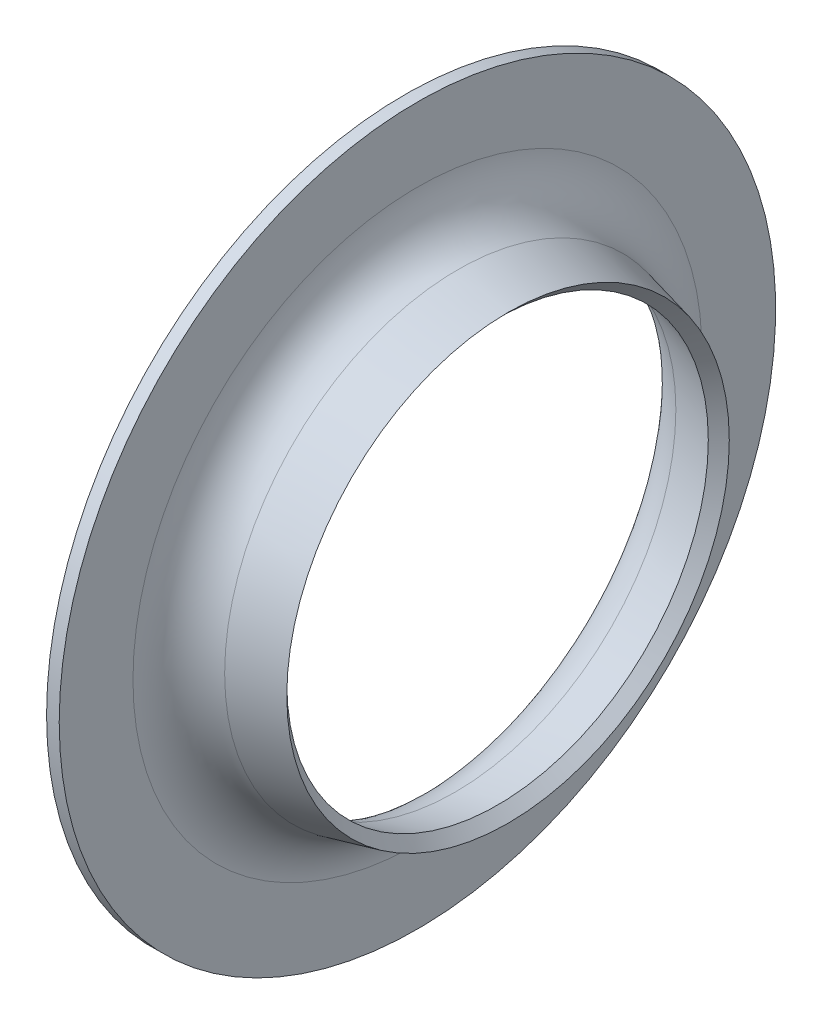
ISO-10303-21;
HEADER;
FILE_DESCRIPTION(('STEP AP214'),'2;1');
FILE_NAME('part.step','',(''),(''),'','','');
FILE_SCHEMA(('AUTOMOTIVE_DESIGN { 1 0 10303 214 1 1 1 1 }'));
ENDSEC;
DATA;
#1=APPLICATION_CONTEXT('core data for automotive mechanical design processes');
#2=APPLICATION_PROTOCOL_DEFINITION('international standard','automotive_design',2000,#1);
#3=PRODUCT_CONTEXT('',#1,'mechanical');
#4=PRODUCT('Part','Part','',(#3));
#5=PRODUCT_RELATED_PRODUCT_CATEGORY('part','',(#4));
#6=PRODUCT_DEFINITION_FORMATION('','',#4);
#7=PRODUCT_DEFINITION_CONTEXT('part definition',#1,'design');
#8=PRODUCT_DEFINITION('design','',#6,#7);
#9=PRODUCT_DEFINITION_SHAPE('','',#8);
#10=(LENGTH_UNIT() NAMED_UNIT(*) SI_UNIT(.MILLI.,.METRE.));
#11=(NAMED_UNIT(*) PLANE_ANGLE_UNIT() SI_UNIT($,.RADIAN.));
#12=(NAMED_UNIT(*) SI_UNIT($,.STERADIAN.) SOLID_ANGLE_UNIT());
#13=UNCERTAINTY_MEASURE_WITH_UNIT(LENGTH_MEASURE(1.E-05),#10,'distance_accuracy_value','');
#14=(GEOMETRIC_REPRESENTATION_CONTEXT(3) GLOBAL_UNCERTAINTY_ASSIGNED_CONTEXT((#13)) GLOBAL_UNIT_ASSIGNED_CONTEXT((#10,
#11,#12)) REPRESENTATION_CONTEXT('',''));
#15=CARTESIAN_POINT('',(0.,0.,0.));
#16=DIRECTION('',(0.,0.,1.));
#17=DIRECTION('',(1.,0.,0.));
#18=AXIS2_PLACEMENT_3D('',#15,#16,#17);
#19=CARTESIAN_POINT('',(-48.7455963614191,0.,0.));
#20=DIRECTION('',(-1.,0.,0.));
#21=DIRECTION('',(0.,0.,1.));
#22=AXIS2_PLACEMENT_3D('',#19,#20,#21);
#23=CYLINDRICAL_SURFACE('',#22,17.);
#24=CARTESIAN_POINT('',(-4.9,0.,0.));
#25=DIRECTION('',(-1.,0.,0.));
#26=DIRECTION('',(0.,0.,1.));
#27=AXIS2_PLACEMENT_3D('',#24,#25,#26);
#28=CIRCLE('',#27,17.);
#29=CARTESIAN_POINT('',(-4.9,0.,17.));
#30=VERTEX_POINT('',#29);
#31=EDGE_CURVE('E63',#30,#30,#28,.T.);
#32=ORIENTED_EDGE('',*,*,#31,.F.);
#33=EDGE_LOOP('',(#32));
#34=FACE_BOUND('',#33,.T.);
#35=CARTESIAN_POINT('',(-4.3,0.,0.));
#36=DIRECTION('',(-1.,0.,0.));
#37=DIRECTION('',(0.,0.,1.));
#38=AXIS2_PLACEMENT_3D('',#35,#36,#37);
#39=CIRCLE('',#38,17.);
#40=CARTESIAN_POINT('',(-4.3,0.,17.));
#41=VERTEX_POINT('',#40);
#42=EDGE_CURVE('E10',#41,#41,#39,.T.);
#43=ORIENTED_EDGE('',*,*,#42,.T.);
#44=EDGE_LOOP('',(#43));
#45=FACE_BOUND('',#44,.T.);
#46=ADVANCED_FACE('F35',(#34,#45),#23,.T.);
#47=CARTESIAN_POINT('',(-4.3,17.,0.));
#48=DIRECTION('',(-1.,0.,0.));
#49=DIRECTION('',(0.,0.,1.));
#50=AXIS2_PLACEMENT_3D('',#47,#48,#49);
#51=PLANE('',#50);
#52=ORIENTED_EDGE('',*,*,#42,.F.);
#53=EDGE_LOOP('',(#52));
#54=FACE_BOUND('',#53,.T.);
#55=CARTESIAN_POINT('',(-4.3,0.,0.));
#56=DIRECTION('',(-1.,0.,0.));
#57=DIRECTION('',(0.,0.,1.));
#58=AXIS2_PLACEMENT_3D('',#55,#56,#57);
#59=CIRCLE('',#58,13.5);
#60=CARTESIAN_POINT('',(-4.3,0.,13.5));
#61=VERTEX_POINT('',#60);
#62=EDGE_CURVE('E41',#61,#61,#59,.T.);
#63=ORIENTED_EDGE('',*,*,#62,.T.);
#64=EDGE_LOOP('',(#63));
#65=FACE_BOUND('',#64,.T.);
#66=ADVANCED_FACE('F70',(#54,#65),#51,.F.);
#67=CARTESIAN_POINT('',(-1.8,0.,0.));
#68=DIRECTION('',(-1.,0.,0.));
#69=DIRECTION('',(0.,0.,1.));
#70=AXIS2_PLACEMENT_3D('',#67,#68,#69);
#71=TOROIDAL_SURFACE('',#70,13.5,2.5);
#72=ORIENTED_EDGE('',*,*,#62,.F.);
#73=EDGE_LOOP('',(#72));
#74=FACE_BOUND('',#73,.T.);
#75=CARTESIAN_POINT('',(-2.38054390325005,0.,0.));
#76=DIRECTION('',(-1.,0.,0.));
#77=DIRECTION('',(0.,0.,1.));
#78=AXIS2_PLACEMENT_3D('',#75,#76,#77);
#79=CIRCLE('',#78,11.0683403247166);
#80=CARTESIAN_POINT('',(-2.38054390325005,0.,11.0683403247166));
#81=VERTEX_POINT('',#80);
#82=EDGE_CURVE('E45',#81,#81,#79,.T.);
#83=ORIENTED_EDGE('',*,*,#82,.T.);
#84=EDGE_LOOP('',(#83));
#85=FACE_BOUND('',#84,.T.);
#86=ADVANCED_FACE('F74',(#74,#85),#71,.F.);
#87=CARTESIAN_POINT('',(0.,0.,0.));
#88=DIRECTION('',(-1.,0.,0.));
#89=DIRECTION('',(0.,0.,1.));
#90=AXIS2_PLACEMENT_3D('',#87,#88,#89);
#91=CONICAL_SURFACE('',#90,10.5,0.23435694921199);
#92=ORIENTED_EDGE('',*,*,#82,.F.);
#93=EDGE_LOOP('',(#92));
#94=FACE_BOUND('',#93,.T.);
#95=CARTESIAN_POINT('',(0.,0.,0.));
#96=DIRECTION('',(-1.,0.,0.));
#97=DIRECTION('',(0.,0.,1.));
#98=AXIS2_PLACEMENT_3D('',#95,#96,#97);
#99=CIRCLE('',#98,10.5);
#100=CARTESIAN_POINT('',(0.,0.,10.5));
#101=VERTEX_POINT('',#100);
#102=EDGE_CURVE('E49',#101,#101,#99,.T.);
#103=ORIENTED_EDGE('',*,*,#102,.T.);
#104=EDGE_LOOP('',(#103));
#105=FACE_BOUND('',#104,.T.);
#106=ADVANCED_FACE('F79',(#94,#105),#91,.T.);
#107=CARTESIAN_POINT('',(-0.497974310464874,0.,0.));
#108=DIRECTION('',(1.,0.,0.));
#109=DIRECTION('',(0.,0.,-1.));
#110=AXIS2_PLACEMENT_3D('',#107,#108,#109);
#111=CONICAL_SURFACE('',#110,10.0020256895351,0.785398163397448);
#112=ORIENTED_EDGE('',*,*,#102,.F.);
#113=EDGE_LOOP('',(#112));
#114=FACE_BOUND('',#113,.T.);
#115=CARTESIAN_POINT('',(-0.497974310464874,0.,0.));
#116=DIRECTION('',(-1.,0.,0.));
#117=DIRECTION('',(0.,0.,1.));
#118=AXIS2_PLACEMENT_3D('',#115,#116,#117);
#119=CIRCLE('',#118,10.0020256895351);
#120=CARTESIAN_POINT('',(-0.497974310464874,0.,10.0020256895351));
#121=VERTEX_POINT('',#120);
#122=EDGE_CURVE('E54',#121,#121,#119,.T.);
#123=ORIENTED_EDGE('',*,*,#122,.T.);
#124=EDGE_LOOP('',(#123));
#125=FACE_BOUND('',#124,.T.);
#126=ADVANCED_FACE('F85',(#114,#125),#111,.F.);
#127=CARTESIAN_POINT('',(-2.51987444003006,0.,0.));
#128=DIRECTION('',(-1.,0.,0.));
#129=DIRECTION('',(0.,0.,1.));
#130=AXIS2_PLACEMENT_3D('',#127,#128,#129);
#131=CONICAL_SURFACE('',#130,10.4847420026486,0.234356949211991);
#132=ORIENTED_EDGE('',*,*,#122,.F.);
#133=EDGE_LOOP('',(#132));
#134=FACE_BOUND('',#133,.T.);
#135=CARTESIAN_POINT('',(-2.51987444003006,0.,0.));
#136=DIRECTION('',(-1.,0.,0.));
#137=DIRECTION('',(0.,0.,1.));
#138=AXIS2_PLACEMENT_3D('',#135,#136,#137);
#139=CIRCLE('',#138,10.4847420026486);
#140=CARTESIAN_POINT('',(-2.51987444003006,0.,10.4847420026486));
#141=VERTEX_POINT('',#140);
#142=EDGE_CURVE('E57',#141,#141,#139,.T.);
#143=ORIENTED_EDGE('',*,*,#142,.T.);
#144=EDGE_LOOP('',(#143));
#145=FACE_BOUND('',#144,.T.);
#146=ADVANCED_FACE('F89',(#134,#145),#131,.F.);
#147=CARTESIAN_POINT('',(-1.8,0.,0.));
#148=DIRECTION('',(-1.,0.,0.));
#149=DIRECTION('',(0.,0.,1.));
#150=AXIS2_PLACEMENT_3D('',#147,#148,#149);
#151=TOROIDAL_SURFACE('',#150,13.5,3.1);
#152=ORIENTED_EDGE('',*,*,#142,.F.);
#153=EDGE_LOOP('',(#152));
#154=FACE_BOUND('',#153,.T.);
#155=CARTESIAN_POINT('',(-4.9,0.,0.));
#156=DIRECTION('',(-1.,0.,0.));
#157=DIRECTION('',(0.,0.,1.));
#158=AXIS2_PLACEMENT_3D('',#155,#156,#157);
#159=CIRCLE('',#158,13.5);
#160=CARTESIAN_POINT('',(-4.9,0.,13.5));
#161=VERTEX_POINT('',#160);
#162=EDGE_CURVE('E60',#161,#161,#159,.T.);
#163=ORIENTED_EDGE('',*,*,#162,.T.);
#164=EDGE_LOOP('',(#163));
#165=FACE_BOUND('',#164,.T.);
#166=ADVANCED_FACE('F93',(#154,#165),#151,.T.);
#167=CARTESIAN_POINT('',(-4.9,17.,0.));
#168=DIRECTION('',(1.,0.,0.));
#169=DIRECTION('',(0.,0.,-1.));
#170=AXIS2_PLACEMENT_3D('',#167,#168,#169);
#171=PLANE('',#170);
#172=ORIENTED_EDGE('',*,*,#162,.F.);
#173=EDGE_LOOP('',(#172));
#174=FACE_BOUND('',#173,.T.);
#175=ORIENTED_EDGE('',*,*,#31,.T.);
#176=EDGE_LOOP('',(#175));
#177=FACE_BOUND('',#176,.T.);
#178=ADVANCED_FACE('F67',(#174,#177),#171,.F.);
#179=CLOSED_SHELL('',(#46,#66,#86,#106,#126,#146,#166,#178));
#180=MANIFOLD_SOLID_BREP('B2',#179);
#181=ADVANCED_BREP_SHAPE_REPRESENTATION('',(#18,#180),#14);
#182=SHAPE_DEFINITION_REPRESENTATION(#9,#181);
ENDSEC;
END-ISO-10303-21;
